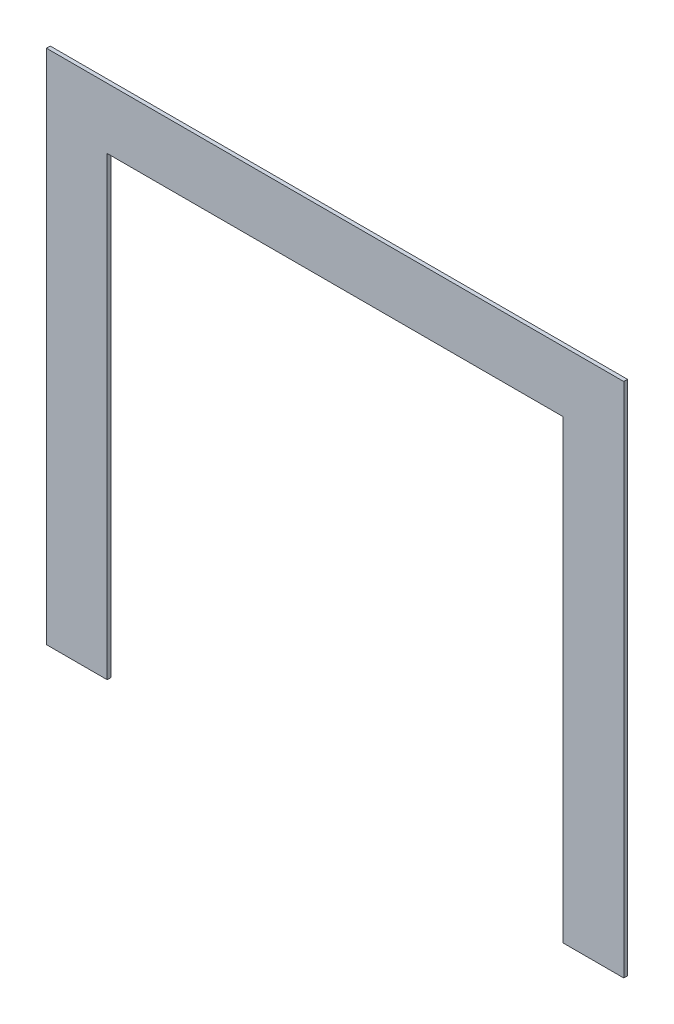
ISO-10303-21;
HEADER;
FILE_DESCRIPTION(('STEP AP214'),'2;1');
FILE_NAME('part.step','',(''),(''),'','','');
FILE_SCHEMA(('AUTOMOTIVE_DESIGN { 1 0 10303 214 1 1 1 1 }'));
ENDSEC;
DATA;
#1=APPLICATION_CONTEXT('core data for automotive mechanical design processes');
#2=APPLICATION_PROTOCOL_DEFINITION('international standard','automotive_design',2000,#1);
#3=PRODUCT_CONTEXT('',#1,'mechanical');
#4=PRODUCT('Part','Part','',(#3));
#5=PRODUCT_RELATED_PRODUCT_CATEGORY('part','',(#4));
#6=PRODUCT_DEFINITION_FORMATION('','',#4);
#7=PRODUCT_DEFINITION_CONTEXT('part definition',#1,'design');
#8=PRODUCT_DEFINITION('design','',#6,#7);
#9=PRODUCT_DEFINITION_SHAPE('','',#8);
#10=(LENGTH_UNIT() NAMED_UNIT(*) SI_UNIT(.MILLI.,.METRE.));
#11=(NAMED_UNIT(*) PLANE_ANGLE_UNIT() SI_UNIT($,.RADIAN.));
#12=(NAMED_UNIT(*) SI_UNIT($,.STERADIAN.) SOLID_ANGLE_UNIT());
#13=UNCERTAINTY_MEASURE_WITH_UNIT(LENGTH_MEASURE(1.E-05),#10,'distance_accuracy_value','');
#14=(GEOMETRIC_REPRESENTATION_CONTEXT(3) GLOBAL_UNCERTAINTY_ASSIGNED_CONTEXT((#13)) GLOBAL_UNIT_ASSIGNED_CONTEXT((#10,
#11,#12)) REPRESENTATION_CONTEXT('',''));
#15=CARTESIAN_POINT('',(0.,0.,0.));
#16=DIRECTION('',(0.,0.,1.));
#17=DIRECTION('',(1.,0.,0.));
#18=AXIS2_PLACEMENT_3D('',#15,#16,#17);
#19=CARTESIAN_POINT('',(0.,0.,3.175));
#20=DIRECTION('',(0.,1.,0.));
#21=DIRECTION('',(0.,0.,1.));
#22=AXIS2_PLACEMENT_3D('',#19,#20,#21);
#23=PLANE('',#22);
#24=DIRECTION('',(1.,0.,0.));
#25=VECTOR('',#24,1.);
#26=CARTESIAN_POINT('',(0.,0.,3.175));
#27=LINE('',#26,#25);
#28=CARTESIAN_POINT('',(431.8,0.,3.175));
#29=VERTEX_POINT('',#28);
#30=CARTESIAN_POINT('',(482.6,0.,3.175));
#31=VERTEX_POINT('',#30);
#32=EDGE_CURVE('E136',#29,#31,#27,.T.);
#33=ORIENTED_EDGE('',*,*,#32,.F.);
#34=DIRECTION('',(0.,0.,1.));
#35=VECTOR('',#34,1.);
#36=CARTESIAN_POINT('',(431.8,0.,-538.815367264149));
#37=LINE('',#36,#35);
#38=CARTESIAN_POINT('',(431.8,0.,0.));
#39=VERTEX_POINT('',#38);
#40=EDGE_CURVE('E123',#39,#29,#37,.T.);
#41=ORIENTED_EDGE('',*,*,#40,.F.);
#42=DIRECTION('',(1.,0.,0.));
#43=VECTOR('',#42,1.);
#44=CARTESIAN_POINT('',(0.,0.,0.));
#45=LINE('',#44,#43);
#46=CARTESIAN_POINT('',(482.6,0.,0.));
#47=VERTEX_POINT('',#46);
#48=EDGE_CURVE('E134',#39,#47,#45,.T.);
#49=ORIENTED_EDGE('',*,*,#48,.T.);
#50=DIRECTION('',(0.,0.,-1.));
#51=VECTOR('',#50,1.);
#52=CARTESIAN_POINT('',(482.6,0.,3.175));
#53=LINE('',#52,#51);
#54=EDGE_CURVE('E53',#31,#47,#53,.T.);
#55=ORIENTED_EDGE('',*,*,#54,.F.);
#56=EDGE_LOOP('',(#33,#41,#49,#55));
#57=FACE_BOUND('',#56,.T.);
#58=ADVANCED_FACE('F44',(#57),#23,.F.);
#59=CARTESIAN_POINT('',(0.,0.,3.175));
#60=DIRECTION('',(1.,0.,0.));
#61=DIRECTION('',(0.,0.,-1.));
#62=AXIS2_PLACEMENT_3D('',#59,#60,#61);
#63=PLANE('',#62);
#64=DIRECTION('',(0.,-1.,0.));
#65=VECTOR('',#64,1.);
#66=CARTESIAN_POINT('',(0.,0.,0.));
#67=LINE('',#66,#65);
#68=CARTESIAN_POINT('',(0.,431.8,0.));
#69=VERTEX_POINT('',#68);
#70=CARTESIAN_POINT('',(0.,0.,0.));
#71=VERTEX_POINT('',#70);
#72=EDGE_CURVE('E145',#69,#71,#67,.T.);
#73=ORIENTED_EDGE('',*,*,#72,.T.);
#74=DIRECTION('',(0.,0.,-1.));
#75=VECTOR('',#74,1.);
#76=CARTESIAN_POINT('',(0.,0.,3.175));
#77=LINE('',#76,#75);
#78=CARTESIAN_POINT('',(0.,0.,3.175));
#79=VERTEX_POINT('',#78);
#80=EDGE_CURVE('E11',#79,#71,#77,.T.);
#81=ORIENTED_EDGE('',*,*,#80,.F.);
#82=DIRECTION('',(0.,-1.,0.));
#83=VECTOR('',#82,1.);
#84=CARTESIAN_POINT('',(0.,0.,3.175));
#85=LINE('',#84,#83);
#86=CARTESIAN_POINT('',(0.,431.8,3.175));
#87=VERTEX_POINT('',#86);
#88=EDGE_CURVE('E158',#87,#79,#85,.T.);
#89=ORIENTED_EDGE('',*,*,#88,.F.);
#90=DIRECTION('',(0.,0.,-1.));
#91=VECTOR('',#90,1.);
#92=CARTESIAN_POINT('',(0.,431.8,3.175));
#93=LINE('',#92,#91);
#94=EDGE_CURVE('E159',#87,#69,#93,.T.);
#95=ORIENTED_EDGE('',*,*,#94,.T.);
#96=EDGE_LOOP('',(#73,#81,#89,#95));
#97=FACE_BOUND('',#96,.T.);
#98=ADVANCED_FACE('F46',(#97),#63,.F.);
#99=CARTESIAN_POINT('',(50.8,0.,0.));
#100=VERTEX_POINT('',#99);
#101=EDGE_CURVE('E144',#71,#100,#45,.T.);
#102=ORIENTED_EDGE('',*,*,#101,.T.);
#103=DIRECTION('',(0.,0.,1.));
#104=VECTOR('',#103,1.);
#105=CARTESIAN_POINT('',(50.8,0.,-538.815367264149));
#106=LINE('',#105,#104);
#107=CARTESIAN_POINT('',(50.8,0.,3.175));
#108=VERTEX_POINT('',#107);
#109=EDGE_CURVE('E60',#100,#108,#106,.T.);
#110=ORIENTED_EDGE('',*,*,#109,.T.);
#111=EDGE_CURVE('E96',#79,#108,#27,.T.);
#112=ORIENTED_EDGE('',*,*,#111,.F.);
#113=ORIENTED_EDGE('',*,*,#80,.T.);
#114=EDGE_LOOP('',(#102,#110,#112,#113));
#115=FACE_BOUND('',#114,.T.);
#116=ADVANCED_FACE('F206',(#115),#23,.F.);
#117=CARTESIAN_POINT('',(482.6,0.,3.175));
#118=DIRECTION('',(-1.,0.,0.));
#119=DIRECTION('',(0.,0.,1.));
#120=AXIS2_PLACEMENT_3D('',#117,#118,#119);
#121=PLANE('',#120);
#122=DIRECTION('',(0.,1.,0.));
#123=VECTOR('',#122,1.);
#124=CARTESIAN_POINT('',(482.6,0.,0.));
#125=LINE('',#124,#123);
#126=CARTESIAN_POINT('',(482.6,431.8,0.));
#127=VERTEX_POINT('',#126);
#128=EDGE_CURVE('E142',#47,#127,#125,.T.);
#129=ORIENTED_EDGE('',*,*,#128,.T.);
#130=DIRECTION('',(0.,0.,-1.));
#131=VECTOR('',#130,1.);
#132=CARTESIAN_POINT('',(482.6,431.8,3.175));
#133=LINE('',#132,#131);
#134=CARTESIAN_POINT('',(482.6,431.8,3.175));
#135=VERTEX_POINT('',#134);
#136=EDGE_CURVE('E162',#135,#127,#133,.T.);
#137=ORIENTED_EDGE('',*,*,#136,.F.);
#138=DIRECTION('',(0.,1.,0.));
#139=VECTOR('',#138,1.);
#140=CARTESIAN_POINT('',(482.6,0.,3.175));
#141=LINE('',#140,#139);
#142=EDGE_CURVE('E169',#31,#135,#141,.T.);
#143=ORIENTED_EDGE('',*,*,#142,.F.);
#144=ORIENTED_EDGE('',*,*,#54,.T.);
#145=EDGE_LOOP('',(#129,#137,#143,#144));
#146=FACE_BOUND('',#145,.T.);
#147=ADVANCED_FACE('F167',(#146),#121,.F.);
#148=CARTESIAN_POINT('',(0.,431.8,3.175));
#149=DIRECTION('',(0.,-1.,0.));
#150=DIRECTION('',(0.,0.,-1.));
#151=AXIS2_PLACEMENT_3D('',#148,#149,#150);
#152=PLANE('',#151);
#153=DIRECTION('',(-1.,0.,0.));
#154=VECTOR('',#153,1.);
#155=CARTESIAN_POINT('',(0.,431.8,0.));
#156=LINE('',#155,#154);
#157=EDGE_CURVE('E90',#127,#69,#156,.T.);
#158=ORIENTED_EDGE('',*,*,#157,.T.);
#159=ORIENTED_EDGE('',*,*,#94,.F.);
#160=DIRECTION('',(-1.,0.,0.));
#161=VECTOR('',#160,1.);
#162=CARTESIAN_POINT('',(0.,431.8,3.175));
#163=LINE('',#162,#161);
#164=EDGE_CURVE('E69',#135,#87,#163,.T.);
#165=ORIENTED_EDGE('',*,*,#164,.F.);
#166=ORIENTED_EDGE('',*,*,#136,.T.);
#167=EDGE_LOOP('',(#158,#159,#165,#166));
#168=FACE_BOUND('',#167,.T.);
#169=ADVANCED_FACE('F211',(#168),#152,.F.);
#170=CARTESIAN_POINT('',(0.,0.,3.175));
#171=DIRECTION('',(0.,0.,-1.));
#172=DIRECTION('',(-1.,0.,0.));
#173=AXIS2_PLACEMENT_3D('',#170,#171,#172);
#174=PLANE('',#173);
#175=DIRECTION('',(-1.,0.,0.));
#176=VECTOR('',#175,1.);
#177=CARTESIAN_POINT('',(50.8,381.,3.175));
#178=LINE('',#177,#176);
#179=CARTESIAN_POINT('',(431.8,381.,3.175));
#180=VERTEX_POINT('',#179);
#181=CARTESIAN_POINT('',(50.8,381.,3.175));
#182=VERTEX_POINT('',#181);
#183=EDGE_CURVE('E138',#180,#182,#178,.T.);
#184=ORIENTED_EDGE('',*,*,#183,.F.);
#185=DIRECTION('',(0.,1.,0.));
#186=VECTOR('',#185,1.);
#187=CARTESIAN_POINT('',(431.8,0.,3.175));
#188=LINE('',#187,#186);
#189=EDGE_CURVE('E194',#29,#180,#188,.T.);
#190=ORIENTED_EDGE('',*,*,#189,.F.);
#191=ORIENTED_EDGE('',*,*,#32,.T.);
#192=ORIENTED_EDGE('',*,*,#142,.T.);
#193=ORIENTED_EDGE('',*,*,#164,.T.);
#194=ORIENTED_EDGE('',*,*,#88,.T.);
#195=ORIENTED_EDGE('',*,*,#111,.T.);
#196=DIRECTION('',(0.,-1.,0.));
#197=VECTOR('',#196,1.);
#198=CARTESIAN_POINT('',(50.8,0.,3.175));
#199=LINE('',#198,#197);
#200=EDGE_CURVE('E191',#182,#108,#199,.T.);
#201=ORIENTED_EDGE('',*,*,#200,.F.);
#202=EDGE_LOOP('',(#184,#190,#191,#192,#193,#194,#195,#201));
#203=FACE_BOUND('',#202,.T.);
#204=ADVANCED_FACE('F204',(#203),#174,.F.);
#205=CARTESIAN_POINT('',(0.,0.,0.));
#206=DIRECTION('',(0.,0.,-1.));
#207=DIRECTION('',(-1.,0.,0.));
#208=AXIS2_PLACEMENT_3D('',#205,#206,#207);
#209=PLANE('',#208);
#210=DIRECTION('',(0.,1.,0.));
#211=VECTOR('',#210,1.);
#212=CARTESIAN_POINT('',(431.8,0.,0.));
#213=LINE('',#212,#211);
#214=CARTESIAN_POINT('',(431.8,381.,0.));
#215=VERTEX_POINT('',#214);
#216=EDGE_CURVE('E119',#39,#215,#213,.T.);
#217=ORIENTED_EDGE('',*,*,#216,.T.);
#218=DIRECTION('',(-1.,0.,0.));
#219=VECTOR('',#218,1.);
#220=CARTESIAN_POINT('',(50.8,381.,0.));
#221=LINE('',#220,#219);
#222=CARTESIAN_POINT('',(50.8,381.,0.));
#223=VERTEX_POINT('',#222);
#224=EDGE_CURVE('E183',#215,#223,#221,.T.);
#225=ORIENTED_EDGE('',*,*,#224,.T.);
#226=DIRECTION('',(0.,-1.,0.));
#227=VECTOR('',#226,1.);
#228=CARTESIAN_POINT('',(50.8,0.,0.));
#229=LINE('',#228,#227);
#230=EDGE_CURVE('E179',#223,#100,#229,.T.);
#231=ORIENTED_EDGE('',*,*,#230,.T.);
#232=ORIENTED_EDGE('',*,*,#101,.F.);
#233=ORIENTED_EDGE('',*,*,#72,.F.);
#234=ORIENTED_EDGE('',*,*,#157,.F.);
#235=ORIENTED_EDGE('',*,*,#128,.F.);
#236=ORIENTED_EDGE('',*,*,#48,.F.);
#237=EDGE_LOOP('',(#217,#225,#231,#232,#233,#234,#235,#236));
#238=FACE_BOUND('',#237,.T.);
#239=ADVANCED_FACE('F141',(#238),#209,.T.);
#240=CARTESIAN_POINT('',(431.8,0.,-538.815367264149));
#241=DIRECTION('',(1.,0.,0.));
#242=DIRECTION('',(0.,0.,-1.));
#243=AXIS2_PLACEMENT_3D('',#240,#241,#242);
#244=PLANE('',#243);
#245=ORIENTED_EDGE('',*,*,#40,.T.);
#246=ORIENTED_EDGE('',*,*,#189,.T.);
#247=DIRECTION('',(0.,0.,1.));
#248=VECTOR('',#247,1.);
#249=CARTESIAN_POINT('',(431.8,381.,-538.815367264149));
#250=LINE('',#249,#248);
#251=EDGE_CURVE('E125',#215,#180,#250,.T.);
#252=ORIENTED_EDGE('',*,*,#251,.F.);
#253=ORIENTED_EDGE('',*,*,#216,.F.);
#254=EDGE_LOOP('',(#245,#246,#252,#253));
#255=FACE_BOUND('',#254,.T.);
#256=ADVANCED_FACE('F121',(#255),#244,.F.);
#257=CARTESIAN_POINT('',(50.8,381.,-538.815367264149));
#258=DIRECTION('',(0.,1.,0.));
#259=DIRECTION('',(0.,0.,1.));
#260=AXIS2_PLACEMENT_3D('',#257,#258,#259);
#261=PLANE('',#260);
#262=ORIENTED_EDGE('',*,*,#251,.T.);
#263=ORIENTED_EDGE('',*,*,#183,.T.);
#264=DIRECTION('',(0.,0.,1.));
#265=VECTOR('',#264,1.);
#266=CARTESIAN_POINT('',(50.8,381.,-538.815367264149));
#267=LINE('',#266,#265);
#268=EDGE_CURVE('E184',#223,#182,#267,.T.);
#269=ORIENTED_EDGE('',*,*,#268,.F.);
#270=ORIENTED_EDGE('',*,*,#224,.F.);
#271=EDGE_LOOP('',(#262,#263,#269,#270));
#272=FACE_BOUND('',#271,.T.);
#273=ADVANCED_FACE('F203',(#272),#261,.F.);
#274=CARTESIAN_POINT('',(50.8,0.,-538.815367264149));
#275=DIRECTION('',(-1.,0.,0.));
#276=DIRECTION('',(0.,0.,1.));
#277=AXIS2_PLACEMENT_3D('',#274,#275,#276);
#278=PLANE('',#277);
#279=ORIENTED_EDGE('',*,*,#268,.T.);
#280=ORIENTED_EDGE('',*,*,#200,.T.);
#281=ORIENTED_EDGE('',*,*,#109,.F.);
#282=ORIENTED_EDGE('',*,*,#230,.F.);
#283=EDGE_LOOP('',(#279,#280,#281,#282));
#284=FACE_BOUND('',#283,.T.);
#285=ADVANCED_FACE('F205',(#284),#278,.F.);
#286=CLOSED_SHELL('',(#58,#98,#116,#147,#169,#204,#239,#256,#273,#285));
#287=MANIFOLD_SOLID_BREP('B2',#286);
#288=ADVANCED_BREP_SHAPE_REPRESENTATION('',(#18,#287),#14);
#289=SHAPE_DEFINITION_REPRESENTATION(#9,#288);
ENDSEC;
END-ISO-10303-21;
